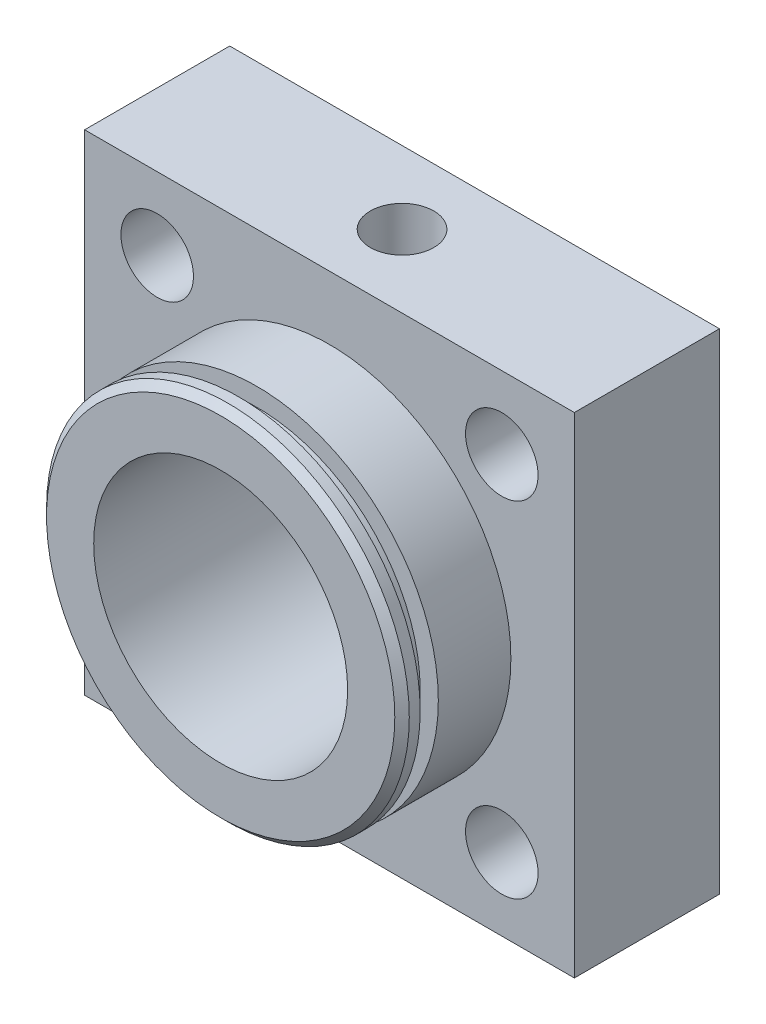
ISO-10303-21;
HEADER;
FILE_DESCRIPTION(('STEP AP214'),'2;1');
FILE_NAME('part.step','',(''),(''),'','','');
FILE_SCHEMA(('AUTOMOTIVE_DESIGN { 1 0 10303 214 1 1 1 1 }'));
ENDSEC;
DATA;
#1=APPLICATION_CONTEXT('core data for automotive mechanical design processes');
#2=APPLICATION_PROTOCOL_DEFINITION('international standard','automotive_design',2000,#1);
#3=PRODUCT_CONTEXT('',#1,'mechanical');
#4=PRODUCT('Part','Part','',(#3));
#5=PRODUCT_RELATED_PRODUCT_CATEGORY('part','',(#4));
#6=PRODUCT_DEFINITION_FORMATION('','',#4);
#7=PRODUCT_DEFINITION_CONTEXT('part definition',#1,'design');
#8=PRODUCT_DEFINITION('design','',#6,#7);
#9=PRODUCT_DEFINITION_SHAPE('','',#8);
#10=(LENGTH_UNIT() NAMED_UNIT(*) SI_UNIT(.MILLI.,.METRE.));
#11=(NAMED_UNIT(*) PLANE_ANGLE_UNIT() SI_UNIT($,.RADIAN.));
#12=(NAMED_UNIT(*) SI_UNIT($,.STERADIAN.) SOLID_ANGLE_UNIT());
#13=UNCERTAINTY_MEASURE_WITH_UNIT(LENGTH_MEASURE(1.E-05),#10,'distance_accuracy_value','');
#14=(GEOMETRIC_REPRESENTATION_CONTEXT(3) GLOBAL_UNCERTAINTY_ASSIGNED_CONTEXT((#13)) GLOBAL_UNIT_ASSIGNED_CONTEXT((#10,
#11,#12)) REPRESENTATION_CONTEXT('',''));
#15=CARTESIAN_POINT('',(0.,0.,0.));
#16=DIRECTION('',(0.,0.,1.));
#17=DIRECTION('',(1.,0.,0.));
#18=AXIS2_PLACEMENT_3D('',#15,#16,#17);
#19=CARTESIAN_POINT('',(-67.5,-67.5,40.));
#20=DIRECTION('',(1.,0.,0.));
#21=DIRECTION('',(0.,0.,-1.));
#22=AXIS2_PLACEMENT_3D('',#19,#20,#21);
#23=PLANE('',#22);
#24=DIRECTION('',(0.,-1.,0.));
#25=VECTOR('',#24,1.);
#26=CARTESIAN_POINT('',(-67.5,-67.5,0.));
#27=LINE('',#26,#25);
#28=CARTESIAN_POINT('',(-67.5,67.5,0.));
#29=VERTEX_POINT('',#28);
#30=CARTESIAN_POINT('',(-67.5,-67.5,0.));
#31=VERTEX_POINT('',#30);
#32=EDGE_CURVE('E123',#29,#31,#27,.T.);
#33=ORIENTED_EDGE('',*,*,#32,.T.);
#34=DIRECTION('',(0.,0.,-1.));
#35=VECTOR('',#34,1.);
#36=CARTESIAN_POINT('',(-67.5,-67.5,40.));
#37=LINE('',#36,#35);
#38=CARTESIAN_POINT('',(-67.5,-67.5,40.));
#39=VERTEX_POINT('',#38);
#40=EDGE_CURVE('E114',#39,#31,#37,.T.);
#41=ORIENTED_EDGE('',*,*,#40,.F.);
#42=DIRECTION('',(0.,-1.,0.));
#43=VECTOR('',#42,1.);
#44=CARTESIAN_POINT('',(-67.5,-67.5,40.));
#45=LINE('',#44,#43);
#46=CARTESIAN_POINT('',(-67.5,67.5,40.));
#47=VERTEX_POINT('',#46);
#48=EDGE_CURVE('E108',#47,#39,#45,.T.);
#49=ORIENTED_EDGE('',*,*,#48,.F.);
#50=DIRECTION('',(0.,0.,-1.));
#51=VECTOR('',#50,1.);
#52=CARTESIAN_POINT('',(-67.5,67.5,40.));
#53=LINE('',#52,#51);
#54=EDGE_CURVE('E119',#47,#29,#53,.T.);
#55=ORIENTED_EDGE('',*,*,#54,.T.);
#56=EDGE_LOOP('',(#33,#41,#49,#55));
#57=FACE_BOUND('',#56,.T.);
#58=ADVANCED_FACE('F47',(#57),#23,.F.);
#59=CARTESIAN_POINT('',(67.5,-67.5,40.));
#60=DIRECTION('',(0.,1.,0.));
#61=DIRECTION('',(-1.,0.,0.));
#62=AXIS2_PLACEMENT_3D('',#59,#60,#61);
#63=PLANE('',#62);
#64=CARTESIAN_POINT('',(0.,-67.5,20.));
#65=DIRECTION('',(0.,-1.,0.));
#66=DIRECTION('',(0.,0.,-1.));
#67=AXIS2_PLACEMENT_3D('',#64,#65,#66);
#68=CIRCLE('',#67,8.74999999999999);
#69=CARTESIAN_POINT('',(0.,-67.5,11.25));
#70=VERTEX_POINT('',#69);
#71=EDGE_CURVE('E307',#70,#70,#68,.T.);
#72=ORIENTED_EDGE('',*,*,#71,.F.);
#73=EDGE_LOOP('',(#72));
#74=FACE_BOUND('',#73,.T.);
#75=DIRECTION('',(1.,0.,0.));
#76=VECTOR('',#75,1.);
#77=CARTESIAN_POINT('',(67.5,-67.5,0.));
#78=LINE('',#77,#76);
#79=CARTESIAN_POINT('',(67.5,-67.5,0.));
#80=VERTEX_POINT('',#79);
#81=EDGE_CURVE('E113',#31,#80,#78,.T.);
#82=ORIENTED_EDGE('',*,*,#81,.T.);
#83=DIRECTION('',(0.,0.,-1.));
#84=VECTOR('',#83,1.);
#85=CARTESIAN_POINT('',(67.5,-67.5,40.));
#86=LINE('',#85,#84);
#87=CARTESIAN_POINT('',(67.5,-67.5,40.));
#88=VERTEX_POINT('',#87);
#89=EDGE_CURVE('E111',#88,#80,#86,.T.);
#90=ORIENTED_EDGE('',*,*,#89,.F.);
#91=DIRECTION('',(1.,0.,0.));
#92=VECTOR('',#91,1.);
#93=CARTESIAN_POINT('',(67.5,-67.5,40.));
#94=LINE('',#93,#92);
#95=EDGE_CURVE('E103',#39,#88,#94,.T.);
#96=ORIENTED_EDGE('',*,*,#95,.F.);
#97=ORIENTED_EDGE('',*,*,#40,.T.);
#98=EDGE_LOOP('',(#82,#90,#96,#97));
#99=FACE_BOUND('',#98,.T.);
#100=ADVANCED_FACE('F112',(#74,#99),#63,.F.);
#101=CARTESIAN_POINT('',(67.5,-67.5,40.));
#102=DIRECTION('',(-1.,0.,0.));
#103=DIRECTION('',(0.,0.,1.));
#104=AXIS2_PLACEMENT_3D('',#101,#102,#103);
#105=PLANE('',#104);
#106=DIRECTION('',(0.,1.,0.));
#107=VECTOR('',#106,1.);
#108=CARTESIAN_POINT('',(67.5,-67.5,0.));
#109=LINE('',#108,#107);
#110=CARTESIAN_POINT('',(67.5,67.5,0.));
#111=VERTEX_POINT('',#110);
#112=EDGE_CURVE('E89',#80,#111,#109,.T.);
#113=ORIENTED_EDGE('',*,*,#112,.T.);
#114=DIRECTION('',(0.,0.,-1.));
#115=VECTOR('',#114,1.);
#116=CARTESIAN_POINT('',(67.5,67.5,40.));
#117=LINE('',#116,#115);
#118=CARTESIAN_POINT('',(67.5,67.5,40.));
#119=VERTEX_POINT('',#118);
#120=EDGE_CURVE('E115',#119,#111,#117,.T.);
#121=ORIENTED_EDGE('',*,*,#120,.F.);
#122=DIRECTION('',(0.,1.,0.));
#123=VECTOR('',#122,1.);
#124=CARTESIAN_POINT('',(67.5,-67.5,40.));
#125=LINE('',#124,#123);
#126=EDGE_CURVE('E106',#88,#119,#125,.T.);
#127=ORIENTED_EDGE('',*,*,#126,.F.);
#128=ORIENTED_EDGE('',*,*,#89,.T.);
#129=EDGE_LOOP('',(#113,#121,#127,#128));
#130=FACE_BOUND('',#129,.T.);
#131=ADVANCED_FACE('F117',(#130),#105,.F.);
#132=CARTESIAN_POINT('',(67.5,67.5,40.));
#133=DIRECTION('',(0.,-1.,0.));
#134=DIRECTION('',(1.,0.,0.));
#135=AXIS2_PLACEMENT_3D('',#132,#133,#134);
#136=PLANE('',#135);
#137=CARTESIAN_POINT('',(0.,67.5,20.));
#138=DIRECTION('',(0.,-1.,0.));
#139=DIRECTION('',(0.,0.,-1.));
#140=AXIS2_PLACEMENT_3D('',#137,#138,#139);
#141=CIRCLE('',#140,8.74999999999998);
#142=CARTESIAN_POINT('',(0.,67.5,11.25));
#143=VERTEX_POINT('',#142);
#144=EDGE_CURVE('E141',#143,#143,#141,.T.);
#145=ORIENTED_EDGE('',*,*,#144,.T.);
#146=EDGE_LOOP('',(#145));
#147=FACE_BOUND('',#146,.T.);
#148=DIRECTION('',(-1.,0.,0.));
#149=VECTOR('',#148,1.);
#150=CARTESIAN_POINT('',(67.5,67.5,0.));
#151=LINE('',#150,#149);
#152=EDGE_CURVE('E95',#111,#29,#151,.T.);
#153=ORIENTED_EDGE('',*,*,#152,.T.);
#154=ORIENTED_EDGE('',*,*,#54,.F.);
#155=DIRECTION('',(-1.,0.,0.));
#156=VECTOR('',#155,1.);
#157=CARTESIAN_POINT('',(67.5,67.5,40.));
#158=LINE('',#157,#156);
#159=EDGE_CURVE('E72',#119,#47,#158,.T.);
#160=ORIENTED_EDGE('',*,*,#159,.F.);
#161=ORIENTED_EDGE('',*,*,#120,.T.);
#162=EDGE_LOOP('',(#153,#154,#160,#161));
#163=FACE_BOUND('',#162,.T.);
#164=ADVANCED_FACE('F174',(#147,#163),#136,.F.);
#165=CARTESIAN_POINT('',(0.,0.,40.));
#166=DIRECTION('',(0.,0.,1.));
#167=DIRECTION('',(1.,0.,0.));
#168=AXIS2_PLACEMENT_3D('',#165,#166,#167);
#169=PLANE('',#168);
#170=CARTESIAN_POINT('',(0.,0.,40.));
#171=DIRECTION('',(0.,0.,1.));
#172=DIRECTION('',(1.,0.,0.));
#173=AXIS2_PLACEMENT_3D('',#170,#171,#172);
#174=CIRCLE('',#173,50.);
#175=CARTESIAN_POINT('',(50.,0.,40.));
#176=VERTEX_POINT('',#175);
#177=EDGE_CURVE('E133',#176,#176,#174,.T.);
#178=ORIENTED_EDGE('',*,*,#177,.F.);
#179=EDGE_LOOP('',(#178));
#180=FACE_BOUND('',#179,.T.);
#181=CARTESIAN_POINT('',(-47.5,-47.5,40.));
#182=DIRECTION('',(0.,0.,1.));
#183=DIRECTION('',(-1.,0.,0.));
#184=AXIS2_PLACEMENT_3D('',#181,#182,#183);
#185=CIRCLE('',#184,9.99999999999999);
#186=CARTESIAN_POINT('',(-57.5,-47.5,40.));
#187=VERTEX_POINT('',#186);
#188=EDGE_CURVE('E269',#187,#187,#185,.T.);
#189=ORIENTED_EDGE('',*,*,#188,.F.);
#190=EDGE_LOOP('',(#189));
#191=FACE_BOUND('',#190,.T.);
#192=CARTESIAN_POINT('',(47.4999999999999,-47.5,40.));
#193=DIRECTION('',(0.,0.,1.));
#194=DIRECTION('',(1.,0.,0.));
#195=AXIS2_PLACEMENT_3D('',#192,#193,#194);
#196=CIRCLE('',#195,10.);
#197=CARTESIAN_POINT('',(57.4999999999999,-47.5,40.));
#198=VERTEX_POINT('',#197);
#199=EDGE_CURVE('E263',#198,#198,#196,.T.);
#200=ORIENTED_EDGE('',*,*,#199,.F.);
#201=EDGE_LOOP('',(#200));
#202=FACE_BOUND('',#201,.T.);
#203=CARTESIAN_POINT('',(47.5,47.5,40.));
#204=DIRECTION('',(0.,0.,1.));
#205=DIRECTION('',(-1.,0.,0.));
#206=AXIS2_PLACEMENT_3D('',#203,#204,#205);
#207=CIRCLE('',#206,10.);
#208=CARTESIAN_POINT('',(37.5,47.5,40.));
#209=VERTEX_POINT('',#208);
#210=EDGE_CURVE('E256',#209,#209,#207,.T.);
#211=ORIENTED_EDGE('',*,*,#210,.F.);
#212=EDGE_LOOP('',(#211));
#213=FACE_BOUND('',#212,.T.);
#214=CARTESIAN_POINT('',(-47.5,47.5,40.));
#215=DIRECTION('',(0.,0.,1.));
#216=DIRECTION('',(1.,0.,0.));
#217=AXIS2_PLACEMENT_3D('',#214,#215,#216);
#218=CIRCLE('',#217,10.);
#219=CARTESIAN_POINT('',(-37.5,47.5,40.));
#220=VERTEX_POINT('',#219);
#221=EDGE_CURVE('E259',#220,#220,#218,.T.);
#222=ORIENTED_EDGE('',*,*,#221,.F.);
#223=EDGE_LOOP('',(#222));
#224=FACE_BOUND('',#223,.T.);
#225=ORIENTED_EDGE('',*,*,#48,.T.);
#226=ORIENTED_EDGE('',*,*,#95,.T.);
#227=ORIENTED_EDGE('',*,*,#126,.T.);
#228=ORIENTED_EDGE('',*,*,#159,.T.);
#229=EDGE_LOOP('',(#225,#226,#227,#228));
#230=FACE_BOUND('',#229,.T.);
#231=ADVANCED_FACE('F104',(#180,#191,#202,#213,#224,#230),#169,.T.);
#232=CARTESIAN_POINT('',(0.,0.,0.));
#233=DIRECTION('',(0.,0.,1.));
#234=DIRECTION('',(1.,0.,0.));
#235=AXIS2_PLACEMENT_3D('',#232,#233,#234);
#236=PLANE('',#235);
#237=CARTESIAN_POINT('',(-47.5,-47.5,0.));
#238=DIRECTION('',(0.,0.,1.));
#239=DIRECTION('',(-1.,0.,0.));
#240=AXIS2_PLACEMENT_3D('',#237,#238,#239);
#241=CIRCLE('',#240,9.99999999999999);
#242=CARTESIAN_POINT('',(-57.5,-47.5,0.));
#243=VERTEX_POINT('',#242);
#244=EDGE_CURVE('E253',#243,#243,#241,.T.);
#245=ORIENTED_EDGE('',*,*,#244,.T.);
#246=EDGE_LOOP('',(#245));
#247=FACE_BOUND('',#246,.T.);
#248=CARTESIAN_POINT('',(47.4999999999999,-47.5,0.));
#249=DIRECTION('',(0.,0.,1.));
#250=DIRECTION('',(1.,0.,0.));
#251=AXIS2_PLACEMENT_3D('',#248,#249,#250);
#252=CIRCLE('',#251,10.);
#253=CARTESIAN_POINT('',(57.4999999999999,-47.5,0.));
#254=VERTEX_POINT('',#253);
#255=EDGE_CURVE('E266',#254,#254,#252,.T.);
#256=ORIENTED_EDGE('',*,*,#255,.T.);
#257=EDGE_LOOP('',(#256));
#258=FACE_BOUND('',#257,.T.);
#259=CARTESIAN_POINT('',(47.5,47.5,0.));
#260=DIRECTION('',(0.,0.,1.));
#261=DIRECTION('',(-1.,0.,0.));
#262=AXIS2_PLACEMENT_3D('',#259,#260,#261);
#263=CIRCLE('',#262,10.);
#264=CARTESIAN_POINT('',(37.5,47.5,0.));
#265=VERTEX_POINT('',#264);
#266=EDGE_CURVE('E260',#265,#265,#263,.T.);
#267=ORIENTED_EDGE('',*,*,#266,.T.);
#268=EDGE_LOOP('',(#267));
#269=FACE_BOUND('',#268,.T.);
#270=CARTESIAN_POINT('',(-47.5,47.5,0.));
#271=DIRECTION('',(0.,0.,1.));
#272=DIRECTION('',(1.,0.,0.));
#273=AXIS2_PLACEMENT_3D('',#270,#271,#272);
#274=CIRCLE('',#273,10.);
#275=CARTESIAN_POINT('',(-37.5,47.5,0.));
#276=VERTEX_POINT('',#275);
#277=EDGE_CURVE('E126',#276,#276,#274,.T.);
#278=ORIENTED_EDGE('',*,*,#277,.T.);
#279=EDGE_LOOP('',(#278));
#280=FACE_BOUND('',#279,.T.);
#281=ORIENTED_EDGE('',*,*,#32,.F.);
#282=ORIENTED_EDGE('',*,*,#152,.F.);
#283=ORIENTED_EDGE('',*,*,#112,.F.);
#284=ORIENTED_EDGE('',*,*,#81,.F.);
#285=EDGE_LOOP('',(#281,#282,#283,#284));
#286=FACE_BOUND('',#285,.T.);
#287=ADVANCED_FACE('F178',(#247,#258,#269,#280,#286),#236,.F.);
#288=CARTESIAN_POINT('',(-47.5,47.5,0.));
#289=DIRECTION('',(0.,0.,1.));
#290=DIRECTION('',(1.,0.,0.));
#291=AXIS2_PLACEMENT_3D('',#288,#289,#290);
#292=CYLINDRICAL_SURFACE('',#291,10.);
#293=ORIENTED_EDGE('',*,*,#277,.F.);
#294=EDGE_LOOP('',(#293));
#295=FACE_BOUND('',#294,.T.);
#296=ORIENTED_EDGE('',*,*,#221,.T.);
#297=EDGE_LOOP('',(#296));
#298=FACE_BOUND('',#297,.T.);
#299=ADVANCED_FACE('F181',(#295,#298),#292,.F.);
#300=CARTESIAN_POINT('',(47.5,47.5,0.));
#301=DIRECTION('',(0.,0.,1.));
#302=DIRECTION('',(1.,0.,0.));
#303=AXIS2_PLACEMENT_3D('',#300,#301,#302);
#304=CYLINDRICAL_SURFACE('',#303,10.);
#305=ORIENTED_EDGE('',*,*,#266,.F.);
#306=EDGE_LOOP('',(#305));
#307=FACE_BOUND('',#306,.T.);
#308=ORIENTED_EDGE('',*,*,#210,.T.);
#309=EDGE_LOOP('',(#308));
#310=FACE_BOUND('',#309,.T.);
#311=ADVANCED_FACE('F188',(#307,#310),#304,.F.);
#312=CARTESIAN_POINT('',(47.4999999999999,-47.5,0.));
#313=DIRECTION('',(0.,0.,1.));
#314=DIRECTION('',(1.,0.,0.));
#315=AXIS2_PLACEMENT_3D('',#312,#313,#314);
#316=CYLINDRICAL_SURFACE('',#315,10.);
#317=ORIENTED_EDGE('',*,*,#255,.F.);
#318=EDGE_LOOP('',(#317));
#319=FACE_BOUND('',#318,.T.);
#320=ORIENTED_EDGE('',*,*,#199,.T.);
#321=EDGE_LOOP('',(#320));
#322=FACE_BOUND('',#321,.T.);
#323=ADVANCED_FACE('F194',(#319,#322),#316,.F.);
#324=CARTESIAN_POINT('',(-47.5,-47.5,0.));
#325=DIRECTION('',(0.,0.,1.));
#326=DIRECTION('',(1.,0.,0.));
#327=AXIS2_PLACEMENT_3D('',#324,#325,#326);
#328=CYLINDRICAL_SURFACE('',#327,9.99999999999999);
#329=ORIENTED_EDGE('',*,*,#244,.F.);
#330=EDGE_LOOP('',(#329));
#331=FACE_BOUND('',#330,.T.);
#332=ORIENTED_EDGE('',*,*,#188,.T.);
#333=EDGE_LOOP('',(#332));
#334=FACE_BOUND('',#333,.T.);
#335=ADVANCED_FACE('F190',(#331,#334),#328,.F.);
#336=CARTESIAN_POINT('',(0.,0.,60.));
#337=DIRECTION('',(0.,0.,-1.));
#338=DIRECTION('',(-1.,0.,0.));
#339=AXIS2_PLACEMENT_3D('',#336,#337,#338);
#340=CYLINDRICAL_SURFACE('',#339,50.);
#341=CARTESIAN_POINT('',(0.,0.,60.));
#342=DIRECTION('',(0.,0.,1.));
#343=DIRECTION('',(1.,0.,0.));
#344=AXIS2_PLACEMENT_3D('',#341,#342,#343);
#345=CIRCLE('',#344,50.);
#346=CARTESIAN_POINT('',(50.,0.,60.));
#347=VERTEX_POINT('',#346);
#348=EDGE_CURVE('E244',#347,#347,#345,.T.);
#349=ORIENTED_EDGE('',*,*,#348,.F.);
#350=EDGE_LOOP('',(#349));
#351=FACE_BOUND('',#350,.T.);
#352=ORIENTED_EDGE('',*,*,#177,.T.);
#353=EDGE_LOOP('',(#352));
#354=FACE_BOUND('',#353,.T.);
#355=ADVANCED_FACE('F193',(#351,#354),#340,.T.);
#356=CARTESIAN_POINT('',(0.,0.,60.));
#357=DIRECTION('',(0.,0.,1.));
#358=DIRECTION('',(1.,0.,0.));
#359=AXIS2_PLACEMENT_3D('',#356,#357,#358);
#360=PLANE('',#359);
#361=CARTESIAN_POINT('',(0.,0.,60.));
#362=DIRECTION('',(0.,0.,1.));
#363=DIRECTION('',(1.,0.,0.));
#364=AXIS2_PLACEMENT_3D('',#361,#362,#363);
#365=CIRCLE('',#364,45.);
#366=CARTESIAN_POINT('',(45.,0.,60.));
#367=VERTEX_POINT('',#366);
#368=EDGE_CURVE('E135',#367,#367,#365,.T.);
#369=ORIENTED_EDGE('',*,*,#368,.F.);
#370=EDGE_LOOP('',(#369));
#371=FACE_BOUND('',#370,.T.);
#372=ORIENTED_EDGE('',*,*,#348,.T.);
#373=EDGE_LOOP('',(#372));
#374=FACE_BOUND('',#373,.T.);
#375=ADVANCED_FACE('F204',(#371,#374),#360,.T.);
#376=CARTESIAN_POINT('',(0.,0.,65.));
#377=DIRECTION('',(0.,0.,-1.));
#378=DIRECTION('',(-1.,0.,0.));
#379=AXIS2_PLACEMENT_3D('',#376,#377,#378);
#380=CYLINDRICAL_SURFACE('',#379,45.);
#381=CARTESIAN_POINT('',(0.,0.,65.));
#382=DIRECTION('',(0.,0.,1.));
#383=DIRECTION('',(1.,0.,0.));
#384=AXIS2_PLACEMENT_3D('',#381,#382,#383);
#385=CIRCLE('',#384,45.);
#386=CARTESIAN_POINT('',(45.,0.,65.));
#387=VERTEX_POINT('',#386);
#388=EDGE_CURVE('E240',#387,#387,#385,.T.);
#389=ORIENTED_EDGE('',*,*,#388,.F.);
#390=EDGE_LOOP('',(#389));
#391=FACE_BOUND('',#390,.T.);
#392=ORIENTED_EDGE('',*,*,#368,.T.);
#393=EDGE_LOOP('',(#392));
#394=FACE_BOUND('',#393,.T.);
#395=ADVANCED_FACE('F208',(#391,#394),#380,.T.);
#396=CARTESIAN_POINT('',(0.,0.,70.));
#397=DIRECTION('',(0.,0.,-1.));
#398=DIRECTION('',(-1.,0.,0.));
#399=AXIS2_PLACEMENT_3D('',#396,#397,#398);
#400=CYLINDRICAL_SURFACE('',#399,50.);
#401=CARTESIAN_POINT('',(0.,0.,67.9999999999999));
#402=DIRECTION('',(0.,0.,1.));
#403=DIRECTION('',(1.,0.,0.));
#404=AXIS2_PLACEMENT_3D('',#401,#402,#403);
#405=CIRCLE('',#404,50.);
#406=CARTESIAN_POINT('',(50.,0.,67.9999999999999));
#407=VERTEX_POINT('',#406);
#408=EDGE_CURVE('E11',#407,#407,#405,.F.);
#409=ORIENTED_EDGE('',*,*,#408,.T.);
#410=EDGE_LOOP('',(#409));
#411=FACE_BOUND('',#410,.T.);
#412=CARTESIAN_POINT('',(0.,0.,65.));
#413=DIRECTION('',(0.,0.,1.));
#414=DIRECTION('',(1.,0.,0.));
#415=AXIS2_PLACEMENT_3D('',#412,#413,#414);
#416=CIRCLE('',#415,50.);
#417=CARTESIAN_POINT('',(50.,0.,65.));
#418=VERTEX_POINT('',#417);
#419=EDGE_CURVE('E238',#418,#418,#416,.T.);
#420=ORIENTED_EDGE('',*,*,#419,.T.);
#421=EDGE_LOOP('',(#420));
#422=FACE_BOUND('',#421,.T.);
#423=ADVANCED_FACE('F212',(#411,#422),#400,.T.);
#424=CARTESIAN_POINT('',(0.,0.,70.));
#425=DIRECTION('',(0.,0.,1.));
#426=DIRECTION('',(1.,0.,0.));
#427=AXIS2_PLACEMENT_3D('',#424,#425,#426);
#428=PLANE('',#427);
#429=CARTESIAN_POINT('',(0.,0.,70.));
#430=DIRECTION('',(0.,0.,1.));
#431=DIRECTION('',(1.,0.,0.));
#432=AXIS2_PLACEMENT_3D('',#429,#430,#431);
#433=CIRCLE('',#432,35.);
#434=CARTESIAN_POINT('',(35.,0.,70.));
#435=VERTEX_POINT('',#434);
#436=EDGE_CURVE('E228',#435,#435,#433,.T.);
#437=ORIENTED_EDGE('',*,*,#436,.F.);
#438=EDGE_LOOP('',(#437));
#439=FACE_BOUND('',#438,.T.);
#440=CARTESIAN_POINT('',(0.,0.,70.));
#441=DIRECTION('',(0.,0.,1.));
#442=DIRECTION('',(1.,0.,0.));
#443=AXIS2_PLACEMENT_3D('',#440,#441,#442);
#444=CIRCLE('',#443,48.);
#445=CARTESIAN_POINT('',(48.,0.,70.));
#446=VERTEX_POINT('',#445);
#447=EDGE_CURVE('E63',#446,#446,#444,.T.);
#448=ORIENTED_EDGE('',*,*,#447,.T.);
#449=EDGE_LOOP('',(#448));
#450=FACE_BOUND('',#449,.T.);
#451=ADVANCED_FACE('F216',(#439,#450),#428,.T.);
#452=CARTESIAN_POINT('',(0.,0.,65.));
#453=DIRECTION('',(0.,0.,1.));
#454=DIRECTION('',(1.,0.,0.));
#455=AXIS2_PLACEMENT_3D('',#452,#453,#454);
#456=PLANE('',#455);
#457=ORIENTED_EDGE('',*,*,#388,.T.);
#458=EDGE_LOOP('',(#457));
#459=FACE_BOUND('',#458,.T.);
#460=ORIENTED_EDGE('',*,*,#419,.F.);
#461=EDGE_LOOP('',(#460));
#462=FACE_BOUND('',#461,.T.);
#463=ADVANCED_FACE('F218',(#459,#462),#456,.F.);
#464=CARTESIAN_POINT('',(0.,0.,70.));
#465=DIRECTION('',(0.,0.,-1.));
#466=DIRECTION('',(-1.,0.,0.));
#467=AXIS2_PLACEMENT_3D('',#464,#465,#466);
#468=CONICAL_SURFACE('',#467,48.,0.785398163397445);
#469=ORIENTED_EDGE('',*,*,#408,.F.);
#470=EDGE_LOOP('',(#469));
#471=FACE_BOUND('',#470,.T.);
#472=ORIENTED_EDGE('',*,*,#447,.F.);
#473=EDGE_LOOP('',(#472));
#474=FACE_BOUND('',#473,.T.);
#475=ADVANCED_FACE('F50',(#471,#474),#468,.T.);
#476=CARTESIAN_POINT('',(0.,0.,5.));
#477=DIRECTION('',(0.,0.,1.));
#478=DIRECTION('',(1.,0.,0.));
#479=AXIS2_PLACEMENT_3D('',#476,#477,#478);
#480=CYLINDRICAL_SURFACE('',#479,35.);
#481=CARTESIAN_POINT('',(0.,35.,11.25));
#482=CARTESIAN_POINT('',(-0.241799523299091,35.0000043695715,11.2499927827405));
#483=CARTESIAN_POINT('',(-0.483520068047024,34.9974905491828,11.2600244008793));
#484=CARTESIAN_POINT('',(-0.965268414696347,34.9875150728127,11.3000497987794));
#485=CARTESIAN_POINT('',(-1.20529602030684,34.9800528523102,11.330045856116));
#486=CARTESIAN_POINT('',(-1.68191721445111,34.9603789436895,11.4097687521843));
#487=CARTESIAN_POINT('',(-1.91850971450473,34.9481657828035,11.4595017093523));
#488=CARTESIAN_POINT('',(-2.3866061796372,34.9193229164648,11.5783057100194));
#489=CARTESIAN_POINT('',(-2.61810823392174,34.9026915822078,11.6473838858388));
#490=CARTESIAN_POINT('',(-3.0739603197344,34.8654985597494,11.8041915451215));
#491=CARTESIAN_POINT('',(-3.29832118373702,34.8449431914352,11.8918910629756));
#492=CARTESIAN_POINT('',(-3.73885381453022,34.8004311564411,12.0853698437051));
#493=CARTESIAN_POINT('',(-3.95502247859617,34.7764732170586,12.1911558747179));
#494=CARTESIAN_POINT('',(-4.37758228105958,34.7258123419916,12.4199618420133));
#495=CARTESIAN_POINT('',(-4.58397735704459,34.6991105257452,12.5429747574995));
#496=CARTESIAN_POINT('',(-4.98585839902349,34.6436486032233,12.8054641101226));
#497=CARTESIAN_POINT('',(-5.18133932040703,34.6148875589461,12.9449480690322));
#498=CARTESIAN_POINT('',(-5.56356700376522,34.5555324255632,13.2421229250962));
#499=CARTESIAN_POINT('',(-5.75008538597825,34.5249142736792,13.4001028259829));
#500=CARTESIAN_POINT('',(-6.10913672588681,34.4631923165244,13.730986928345));
#501=CARTESIAN_POINT('',(-6.28167567208607,34.4320887260886,13.9038846730749));
#502=CARTESIAN_POINT('',(-6.61181639747486,34.3702212811019,14.2636235239612));
#503=CARTESIAN_POINT('',(-6.76941037131434,34.3394576114117,14.4504718260552));
#504=CARTESIAN_POINT('',(-7.06844737761761,34.2791527863576,14.8367464190324));
#505=CARTESIAN_POINT('',(-7.20989643016502,34.2496111779512,15.0361679782833));
#506=CARTESIAN_POINT('',(-7.47776612625394,34.1921346589743,15.4494963906511));
#507=CARTESIAN_POINT('',(-7.60392393043699,34.1642312194141,15.6635780964474));
#508=CARTESIAN_POINT('',(-7.83766283188959,34.1113676301319,16.1018971284711));
#509=CARTESIAN_POINT('',(-7.94525106980855,34.0864063502223,16.326130508966));
#510=CARTESIAN_POINT('',(-8.14107411847624,34.0401680678269,16.7832859209123));
#511=CARTESIAN_POINT('',(-8.22930748528217,34.0188913402468,17.0162085991008));
#512=CARTESIAN_POINT('',(-8.38568051248059,33.9806834660429,17.4890508397448));
#513=CARTESIAN_POINT('',(-8.45382065418537,33.9637522153291,17.72897023445));
#514=CARTESIAN_POINT('',(-8.56826273941721,33.9350598380527,18.2091703602281));
#515=CARTESIAN_POINT('',(-8.61497474459365,33.9232019513377,18.4493476080716));
#516=CARTESIAN_POINT('',(-8.68813785695589,33.9045379070742,18.932963659827));
#517=CARTESIAN_POINT('',(-8.71458920976721,33.8977316882829,19.1764024241621));
#518=CARTESIAN_POINT('',(-8.74699568171501,33.8893839980862,19.6646959067607));
#519=CARTESIAN_POINT('',(-8.7529537109232,33.887841779188,19.9095504190398));
#520=CARTESIAN_POINT('',(-8.74432825221232,33.8900685154391,20.3988712121535));
#521=CARTESIAN_POINT('',(-8.72974504991735,33.8938373967381,20.643337498339));
#522=CARTESIAN_POINT('',(-8.68077538249157,33.9064117105816,21.1240939355488));
#523=CARTESIAN_POINT('',(-8.64688206589014,33.9150916851047,21.3604378061277));
#524=CARTESIAN_POINT('',(-8.55993865039065,33.9371398245965,21.8294400669052));
#525=CARTESIAN_POINT('',(-8.50688165033293,33.9505096784183,22.0620970978647));
#526=CARTESIAN_POINT('',(-8.38205168790234,33.9815441010646,22.5219983088027));
#527=CARTESIAN_POINT('',(-8.31028163662384,33.9992080018571,22.7492433247053));
#528=CARTESIAN_POINT('',(-8.14857675360341,34.0383256138059,23.1968461878021));
#529=CARTESIAN_POINT('',(-8.05864109786731,34.0597794968708,23.4172037220555));
#530=CARTESIAN_POINT('',(-7.86028234631322,34.1061054991642,23.8517633359928));
#531=CARTESIAN_POINT('',(-7.75168255190294,34.1310098018236,24.0658813071379));
#532=CARTESIAN_POINT('',(-7.51741613256294,34.1833710075284,24.4842429822625));
#533=CARTESIAN_POINT('',(-7.39174905870467,34.2108279777118,24.688486426316));
#534=CARTESIAN_POINT('',(-7.12419692769022,34.2675431492183,25.0858325843066));
#535=CARTESIAN_POINT('',(-6.98230968739967,34.2968015927634,25.278933793292));
#536=CARTESIAN_POINT('',(-6.68326713116924,34.3563265968551,25.6527637059941));
#537=CARTESIAN_POINT('',(-6.52611151483398,34.3865931772283,25.8334921661656));
#538=CARTESIAN_POINT('',(-6.1928427657729,34.4481961684433,26.1864183382612));
#539=CARTESIAN_POINT('',(-6.0163164559308,34.4795384500757,26.3582251134267));
#540=CARTESIAN_POINT('',(-5.64934842718306,34.5415616776077,26.6864007085305));
#541=CARTESIAN_POINT('',(-5.45890676688688,34.572242626292,26.8427695934844));
#542=CARTESIAN_POINT('',(-5.06534815423349,34.6320929199522,27.1390063436303));
#543=CARTESIAN_POINT('',(-4.86223035738417,34.6612621639799,27.2788731076427));
#544=CARTESIAN_POINT('',(-4.44468838286475,34.7172738797167,27.5410885509639));
#545=CARTESIAN_POINT('',(-4.23026462914772,34.7441164385726,27.6634378865065));
#546=CARTESIAN_POINT('',(-3.79074451033565,34.7948180728427,27.890128045316));
#547=CARTESIAN_POINT('',(-3.56561173142843,34.8186657906871,27.9944008521543));
#548=CARTESIAN_POINT('',(-3.10707469593024,34.8625745531645,28.1835241029548));
#549=CARTESIAN_POINT('',(-2.87367374263857,34.8826370902314,28.2683822046311));
#550=CARTESIAN_POINT('',(-2.40018489282947,34.9184117209907,28.4180318827279));
#551=CARTESIAN_POINT('',(-2.16009669807542,34.9341236203111,28.4828225626176));
#552=CARTESIAN_POINT('',(-1.67502340418714,34.96073923671,28.5917741764395));
#553=CARTESIAN_POINT('',(-1.43003842593633,34.971643072329,28.6359356189768));
#554=CARTESIAN_POINT('',(-0.94334164825739,34.9881104053636,28.7023776627804));
#555=CARTESIAN_POINT('',(-0.701706644020073,34.9938034876629,28.7251895464599));
#556=CARTESIAN_POINT('',(-0.217312358656552,35.0001634242995,28.7506624806319));
#557=CARTESIAN_POINT('',(0.0254469032188993,35.0008303643839,28.7533238748955));
#558=CARTESIAN_POINT('',(0.51028754600816,34.9971195241709,28.7384738771979));
#559=CARTESIAN_POINT('',(0.752368981458318,34.9927421621424,28.720964157807));
#560=CARTESIAN_POINT('',(1.23410313242198,34.9790659361253,28.6659254013057));
#561=CARTESIAN_POINT('',(1.47375585742777,34.9697670913791,28.6283964424687));
#562=CARTESIAN_POINT('',(1.94532440898076,34.9466823513444,28.5343511030556));
#563=CARTESIAN_POINT('',(2.17730238816364,34.9329660403135,28.4781287638607));
#564=CARTESIAN_POINT('',(2.63571350382193,34.9013727768726,28.3469976258953));
#565=CARTESIAN_POINT('',(2.86214460470993,34.8834943215936,28.2720820766687));
#566=CARTESIAN_POINT('',(3.30782932633503,34.8440570603617,28.1041635764653));
#567=CARTESIAN_POINT('',(3.52708385989012,34.8224987246534,28.0111629363347));
#568=CARTESIAN_POINT('',(3.95702806331242,34.7762661259076,27.8077519670753));
#569=CARTESIAN_POINT('',(4.16771733143583,34.7515917169368,27.6973408225093));
#570=CARTESIAN_POINT('',(4.58283276985595,34.6993109881678,27.4577867126412));
#571=CARTESIAN_POINT('',(4.78708190998904,34.6716604788256,27.3283466050096));
#572=CARTESIAN_POINT('',(5.18400810648092,34.6145384635652,27.0531471937465));
#573=CARTESIAN_POINT('',(5.37668478897487,34.5850668988775,26.9073873633183));
#574=CARTESIAN_POINT('',(5.74926397310817,34.5250862204719,26.6005089993607));
#575=CARTESIAN_POINT('',(5.92916468000145,34.4945769618674,26.4393883153839));
#576=CARTESIAN_POINT('',(6.27502133453905,34.4333407763495,26.1028540567975));
#577=CARTESIAN_POINT('',(6.44097710879124,34.4026138467347,25.9274403045205));
#578=CARTESIAN_POINT('',(6.76177551246698,34.3410210534494,25.5589585347706));
#579=CARTESIAN_POINT('',(6.91624448825218,34.3101703553513,25.3655624504475));
#580=CARTESIAN_POINT('',(7.20834844804723,34.2499920889207,24.9662270549499));
#581=CARTESIAN_POINT('',(7.34598350357079,34.2206645141179,24.7602877970666));
#582=CARTESIAN_POINT('',(7.60343046336959,34.1643851838145,24.3372405510884));
#583=CARTESIAN_POINT('',(7.72324229172896,34.1374334384336,24.1201325154267));
#584=CARTESIAN_POINT('',(7.94413160786342,34.0867074143669,23.6762381203699));
#585=CARTESIAN_POINT('',(8.04520997194652,34.0629329870681,23.4494522142939));
#586=CARTESIAN_POINT('',(8.22730651900035,34.019408389123,22.98911976521));
#587=CARTESIAN_POINT('',(8.30843756639257,33.9996356943008,22.7556200210376));
#588=CARTESIAN_POINT('',(8.4506988953312,33.964555944106,22.2823701603687));
#589=CARTESIAN_POINT('',(8.51183675802621,33.9492471963033,22.0426224503368));
#590=CARTESIAN_POINT('',(8.61362779462078,33.9235637360288,21.5585528933568));
#591=CARTESIAN_POINT('',(8.65428085473065,33.9131890509649,21.3142310210078));
#592=CARTESIAN_POINT('',(8.71473904507718,33.8977034938462,20.8228575874181));
#593=CARTESIAN_POINT('',(8.73454467689365,33.8925924951495,20.5758060919953));
#594=CARTESIAN_POINT('',(8.75286313708363,33.8878661068046,20.08798487179));
#595=CARTESIAN_POINT('',(8.75197192932361,33.8880969000187,19.8472388150264));
#596=CARTESIAN_POINT('',(8.73036501136017,33.8936697862549,19.366698151602));
#597=CARTESIAN_POINT('',(8.70964945897608,33.8990118385867,19.126903537382));
#598=CARTESIAN_POINT('',(8.6485721735212,33.9146456483631,18.6500036267133));
#599=CARTESIAN_POINT('',(8.60821108341681,33.924937243817,18.4128982425102));
#600=CARTESIAN_POINT('',(8.50818106883449,33.9501621645281,17.9430491110037));
#601=CARTESIAN_POINT('',(8.44851204756691,33.9650955130541,17.7103053855713));
#602=CARTESIAN_POINT('',(8.31077651422011,33.9990586211512,17.2522102166318));
#603=CARTESIAN_POINT('',(8.2328255898824,34.0180625812892,17.0268220694459));
#604=CARTESIAN_POINT('',(8.05890117165103,34.0596844373231,16.5833704894051));
#605=CARTESIAN_POINT('',(7.96292157734662,34.0823035561028,16.3653095654129));
#606=CARTESIAN_POINT('',(7.7536693156567,34.1305161402331,15.938017731216));
#607=CARTESIAN_POINT('',(7.64039802758809,34.1561093683073,15.7287861184161));
#608=CARTESIAN_POINT('',(7.39734356875771,34.209571551935,15.3204414187231));
#609=CARTESIAN_POINT('',(7.26755960497191,34.2374406167629,15.1213288184403));
#610=CARTESIAN_POINT('',(6.98875632579051,34.2954527203306,14.7294104040221));
#611=CARTESIAN_POINT('',(6.83932358891428,34.3256361112221,14.5369045517282));
#612=CARTESIAN_POINT('',(6.52499681599357,34.3867713572701,14.165089424418));
#613=CARTESIAN_POINT('',(6.36010255768644,34.4177232234689,13.9857803391742));
#614=CARTESIAN_POINT('',(6.01589396633648,34.479553283205,13.6414790573763));
#615=CARTESIAN_POINT('',(5.83657615340854,34.5104314571016,13.4764903358937));
#616=CARTESIAN_POINT('',(5.46472074024133,34.5712642989083,13.1619720085236));
#617=CARTESIAN_POINT('',(5.27218341824645,34.6012189862367,13.0124420774252));
#618=CARTESIAN_POINT('',(4.87147782235829,34.6599256024024,12.7272579095282));
#619=CARTESIAN_POINT('',(4.66308747718853,34.6886453540504,12.5919088113217));
#620=CARTESIAN_POINT('',(4.2353743584563,34.7434608862658,12.3393361981768));
#621=CARTESIAN_POINT('',(4.01605563124779,34.7695576273911,12.2221060394849));
#622=CARTESIAN_POINT('',(3.56801218673186,34.8183861246489,12.0066569968068));
#623=CARTESIAN_POINT('',(3.33929158110853,34.8411193321506,11.9084299073116));
#624=CARTESIAN_POINT('',(2.87406877701833,34.8825793149896,11.7317365652019));
#625=CARTESIAN_POINT('',(2.63756775851887,34.9013066946433,11.6532673316148));
#626=CARTESIAN_POINT('',(2.00925711089441,34.944444728733,11.4742437545666));
#627=CARTESIAN_POINT('',(1.61232089758284,34.965147984662,11.3902984072739));
#628=CARTESIAN_POINT('',(0.81018219110818,34.9929214483973,11.2781846715056));
#629=CARTESIAN_POINT('',(0.404980321990078,34.9999926815799,11.2500120878985));
#630=CARTESIAN_POINT('',(0.,35.,11.25));
#631=B_SPLINE_CURVE_WITH_KNOTS('',3,(#481,#482,#483,#484,#485,#486,#487,#488,#489,#490,#491,
#492,#493,#494,#495,#496,#497,#498,#499,#500,#501,#502,#503,#504,#505,#506,#507,#508,#509,#510,
#511,#512,#513,#514,#515,#516,#517,#518,#519,#520,#521,#522,#523,#524,#525,#526,#527,#528,#529,
#530,#531,#532,#533,#534,#535,#536,#537,#538,#539,#540,#541,#542,#543,#544,#545,#546,#547,#548,
#549,#550,#551,#552,#553,#554,#555,#556,#557,#558,#559,#560,#561,#562,#563,#564,#565,#566,#567,
#568,#569,#570,#571,#572,#573,#574,#575,#576,#577,#578,#579,#580,#581,#582,#583,#584,#585,#586,
#587,#588,#589,#590,#591,#592,#593,#594,#595,#596,#597,#598,#599,#600,#601,#602,#603,#604,#605,
#606,#607,#608,#609,#610,#611,#612,#613,#614,#615,#616,#617,#618,#619,#620,#621,#622,#623,#624,
#625,#626,#627,#628,#629,#630),.UNSPECIFIED.,.T.,.F.,(4,2,2,2,2,2,2,2,2,2,2,2,2,2,2,2,2,2,2,2,2,
2,2,2,2,2,2,2,2,2,2,2,2,2,2,2,2,2,2,2,2,2,2,2,2,2,2,2,2,2,2,2,2,2,2,2,2,2,2,2,2,2,2,2,2,2,2,2,2,
2,2,2,2,2,4),(0.,0.725041703178784,1.4501661344571,2.17551553002221,2.90113270495955,
3.62559094263875,4.35032087490534,5.0747562992895,5.79952383779761,6.53769478506493,
7.27554782447713,8.01378412616545,8.7517442503449,9.50098726798362,10.2499415303971,
10.9989516484963,11.7479438233803,12.4819344522352,13.2159161825767,13.9497936825007,
14.6836609780208,15.3995766020652,16.1157502966444,16.8318126461215,17.5479074835771,
18.2711983677293,18.9945082806221,19.7179156614445,20.4413372777202,21.1854153317681,
21.9294902520474,22.6736147960883,23.4177114566125,24.1645498635337,24.9110931862632,
25.6576698567027,26.4042281196394,27.1316716554447,27.8591027808955,28.586473592769,
29.3138415607126,30.0302705852323,30.7469587005986,31.4635553003017,32.1801854724463,
32.9095086923284,33.6388554613838,34.3683044859176,35.0977625791224,35.8451593049535,
36.5925528555899,37.3399495895674,38.0873113532308,38.8303417563212,39.5730900846289,
40.3158425387348,41.0585771221396,41.7799519553553,42.5013210458368,43.2226665286727,
43.9440156276316,44.660921403851,45.3780701998728,46.0951618205194,46.8122878926199,
47.5481188104163,48.2839603075601,49.0199798723881,49.7559839502143,50.5055001454855,
51.2547408569034,52.0036573211699,52.7524607246333,53.9668953400134,55.1812386042321),.UNSPECIFIED.);
#632=CARTESIAN_POINT('',(0.,35.,11.25));
#633=VERTEX_POINT('',#632);
#634=EDGE_CURVE('E52',#633,#633,#631,.T.);
#635=ORIENTED_EDGE('',*,*,#634,.T.);
#636=EDGE_LOOP('',(#635));
#637=FACE_BOUND('',#636,.T.);
#638=CARTESIAN_POINT('',(0.,-35.,11.25));
#639=CARTESIAN_POINT('',(0.241799523299119,-35.0000043695715,11.2499927827405));
#640=CARTESIAN_POINT('',(0.483520068047052,-34.9974905491828,11.2600244008793));
#641=CARTESIAN_POINT('',(0.965268414696375,-34.9875150728127,11.3000497987794));
#642=CARTESIAN_POINT('',(1.20529602030686,-34.9800528523102,11.330045856116));
#643=CARTESIAN_POINT('',(1.68191721445113,-34.9603789436895,11.4097687521843));
#644=CARTESIAN_POINT('',(1.91850971450476,-34.9481657828035,11.4595017093523));
#645=CARTESIAN_POINT('',(2.38660617963723,-34.9193229164648,11.5783057100194));
#646=CARTESIAN_POINT('',(2.61810823392176,-34.9026915822078,11.6473838858388));
#647=CARTESIAN_POINT('',(3.07396031973442,-34.8654985597494,11.8041915451215));
#648=CARTESIAN_POINT('',(3.29832118373705,-34.8449431914352,11.8918910629756));
#649=CARTESIAN_POINT('',(3.73885381453024,-34.8004311564411,12.0853698437051));
#650=CARTESIAN_POINT('',(3.95502247859619,-34.7764732170586,12.1911558747179));
#651=CARTESIAN_POINT('',(4.37758228105961,-34.7258123419916,12.4199618420133));
#652=CARTESIAN_POINT('',(4.58397735704462,-34.6991105257452,12.5429747574995));
#653=CARTESIAN_POINT('',(4.98585839902351,-34.6436486032233,12.8054641101226));
#654=CARTESIAN_POINT('',(5.18133932040706,-34.614887558946,12.9449480690322));
#655=CARTESIAN_POINT('',(5.56356700376525,-34.5555324255632,13.2421229250962));
#656=CARTESIAN_POINT('',(5.75008538597828,-34.5249142736792,13.4001028259829));
#657=CARTESIAN_POINT('',(6.10913672588684,-34.4631923165244,13.730986928345));
#658=CARTESIAN_POINT('',(6.2816756720861,-34.4320887260886,13.9038846730749));
#659=CARTESIAN_POINT('',(6.61181639747488,-34.3702212811019,14.2636235239612));
#660=CARTESIAN_POINT('',(6.76941037131436,-34.3394576114117,14.4504718260552));
#661=CARTESIAN_POINT('',(7.06844737761764,-34.2791527863576,14.8367464190324));
#662=CARTESIAN_POINT('',(7.20989643016505,-34.2496111779512,15.0361679782833));
#663=CARTESIAN_POINT('',(7.47776612625397,-34.1921346589743,15.4494963906511));
#664=CARTESIAN_POINT('',(7.60392393043702,-34.1642312194141,15.6635780964474));
#665=CARTESIAN_POINT('',(7.83766283188962,-34.1113676301318,16.1018971284711));
#666=CARTESIAN_POINT('',(7.94525106980858,-34.0864063502223,16.326130508966));
#667=CARTESIAN_POINT('',(8.14107411847626,-34.0401680678269,16.7832859209123));
#668=CARTESIAN_POINT('',(8.2293074852822,-34.0188913402468,17.0162085991008));
#669=CARTESIAN_POINT('',(8.38568051248062,-33.9806834660429,17.4890508397448));
#670=CARTESIAN_POINT('',(8.4538206541854,-33.9637522153291,17.72897023445));
#671=CARTESIAN_POINT('',(8.56826273941724,-33.9350598380527,18.2091703602281));
#672=CARTESIAN_POINT('',(8.61497474459368,-33.9232019513377,18.4493476080716));
#673=CARTESIAN_POINT('',(8.68813785695591,-33.9045379070742,18.932963659827));
#674=CARTESIAN_POINT('',(8.71458920976724,-33.8977316882829,19.1764024241621));
#675=CARTESIAN_POINT('',(8.74699568171504,-33.8893839980862,19.6646959067607));
#676=CARTESIAN_POINT('',(8.75295371092322,-33.887841779188,19.9095504190398));
#677=CARTESIAN_POINT('',(8.74432825221235,-33.8900685154391,20.3988712121535));
#678=CARTESIAN_POINT('',(8.72974504991738,-33.893837396738,20.643337498339));
#679=CARTESIAN_POINT('',(8.6807753824916,-33.9064117105816,21.1240939355488));
#680=CARTESIAN_POINT('',(8.64688206589017,-33.9150916851047,21.3604378061277));
#681=CARTESIAN_POINT('',(8.55993865039068,-33.9371398245965,21.8294400669052));
#682=CARTESIAN_POINT('',(8.50688165033296,-33.9505096784183,22.0620970978647));
#683=CARTESIAN_POINT('',(8.38205168790237,-33.9815441010646,22.5219983088027));
#684=CARTESIAN_POINT('',(8.31028163662387,-33.9992080018571,22.7492433247053));
#685=CARTESIAN_POINT('',(8.14857675360344,-34.0383256138059,23.1968461878021));
#686=CARTESIAN_POINT('',(8.05864109786733,-34.0597794968708,23.4172037220555));
#687=CARTESIAN_POINT('',(7.86028234631324,-34.1061054991642,23.8517633359928));
#688=CARTESIAN_POINT('',(7.75168255190297,-34.1310098018236,24.0658813071379));
#689=CARTESIAN_POINT('',(7.51741613256297,-34.1833710075284,24.4842429822625));
#690=CARTESIAN_POINT('',(7.3917490587047,-34.2108279777118,24.688486426316));
#691=CARTESIAN_POINT('',(7.12419692769025,-34.2675431492183,25.0858325843066));
#692=CARTESIAN_POINT('',(6.9823096873997,-34.2968015927634,25.278933793292));
#693=CARTESIAN_POINT('',(6.68326713116927,-34.3563265968551,25.6527637059941));
#694=CARTESIAN_POINT('',(6.52611151483401,-34.3865931772283,25.8334921661656));
#695=CARTESIAN_POINT('',(6.19284276577294,-34.4481961684433,26.1864183382612));
#696=CARTESIAN_POINT('',(6.01631645593083,-34.4795384500757,26.3582251134267));
#697=CARTESIAN_POINT('',(5.64934842718309,-34.5415616776077,26.6864007085305));
#698=CARTESIAN_POINT('',(5.45890676688691,-34.572242626292,26.8427695934844));
#699=CARTESIAN_POINT('',(5.06534815423352,-34.6320929199522,27.1390063436303));
#700=CARTESIAN_POINT('',(4.8622303573842,-34.6612621639799,27.2788731076427));
#701=CARTESIAN_POINT('',(4.44468838286478,-34.7172738797167,27.5410885509639));
#702=CARTESIAN_POINT('',(4.23026462914775,-34.7441164385726,27.6634378865065));
#703=CARTESIAN_POINT('',(3.79074451033568,-34.7948180728427,27.890128045316));
#704=CARTESIAN_POINT('',(3.56561173142846,-34.8186657906871,27.9944008521543));
#705=CARTESIAN_POINT('',(3.10707469593027,-34.8625745531645,28.1835241029548));
#706=CARTESIAN_POINT('',(2.8736737426386,-34.8826370902314,28.2683822046311));
#707=CARTESIAN_POINT('',(2.4001848928295,-34.9184117209907,28.4180318827279));
#708=CARTESIAN_POINT('',(2.16009669807545,-34.9341236203111,28.4828225626176));
#709=CARTESIAN_POINT('',(1.67502340418717,-34.96073923671,28.5917741764395));
#710=CARTESIAN_POINT('',(1.43003842593636,-34.971643072329,28.6359356189768));
#711=CARTESIAN_POINT('',(0.943341648257419,-34.9881104053636,28.7023776627804));
#712=CARTESIAN_POINT('',(0.701706644020102,-34.9938034876629,28.7251895464599));
#713=CARTESIAN_POINT('',(0.217312358656581,-35.0001634242995,28.7506624806319));
#714=CARTESIAN_POINT('',(-0.0254469032188705,-35.0008303643839,28.7533238748955));
#715=CARTESIAN_POINT('',(-0.510287546008132,-34.9971195241709,28.7384738771979));
#716=CARTESIAN_POINT('',(-0.752368981458292,-34.9927421621424,28.720964157807));
#717=CARTESIAN_POINT('',(-1.23410313242195,-34.9790659361253,28.6659254013057));
#718=CARTESIAN_POINT('',(-1.47375585742774,-34.9697670913791,28.6283964424687));
#719=CARTESIAN_POINT('',(-1.94532440898073,-34.9466823513444,28.5343511030556));
#720=CARTESIAN_POINT('',(-2.17730238816361,-34.9329660403135,28.4781287638607));
#721=CARTESIAN_POINT('',(-2.6357135038219,-34.9013727768726,28.3469976258953));
#722=CARTESIAN_POINT('',(-2.86214460470991,-34.8834943215936,28.2720820766687));
#723=CARTESIAN_POINT('',(-3.307829326335,-34.8440570603617,28.1041635764653));
#724=CARTESIAN_POINT('',(-3.5270838598901,-34.8224987246534,28.0111629363347));
#725=CARTESIAN_POINT('',(-3.95702806331239,-34.7762661259076,27.8077519670753));
#726=CARTESIAN_POINT('',(-4.1677173314358,-34.7515917169368,27.6973408225093));
#727=CARTESIAN_POINT('',(-4.58283276985592,-34.6993109881678,27.4577867126412));
#728=CARTESIAN_POINT('',(-4.78708190998901,-34.6716604788256,27.3283466050096));
#729=CARTESIAN_POINT('',(-5.1840081064809,-34.6145384635652,27.0531471937465));
#730=CARTESIAN_POINT('',(-5.37668478897484,-34.5850668988775,26.9073873633183));
#731=CARTESIAN_POINT('',(-5.74926397310815,-34.5250862204719,26.6005089993607));
#732=CARTESIAN_POINT('',(-5.92916468000142,-34.4945769618674,26.4393883153839));
#733=CARTESIAN_POINT('',(-6.27502133453902,-34.4333407763495,26.1028540567975));
#734=CARTESIAN_POINT('',(-6.44097710879122,-34.4026138467347,25.9274403045205));
#735=CARTESIAN_POINT('',(-6.76177551246696,-34.3410210534494,25.5589585347705));
#736=CARTESIAN_POINT('',(-6.91624448825216,-34.3101703553514,25.3655624504475));
#737=CARTESIAN_POINT('',(-7.2083484480472,-34.2499920889207,24.9662270549498));
#738=CARTESIAN_POINT('',(-7.34598350357076,-34.2206645141179,24.7602877970666));
#739=CARTESIAN_POINT('',(-7.60343046336957,-34.1643851838145,24.3372405510884));
#740=CARTESIAN_POINT('',(-7.72324229172894,-34.1374334384336,24.1201325154267));
#741=CARTESIAN_POINT('',(-7.9441316078634,-34.086707414367,23.6762381203699));
#742=CARTESIAN_POINT('',(-8.04520997194649,-34.0629329870681,23.4494522142939));
#743=CARTESIAN_POINT('',(-8.22730651900032,-34.019408389123,22.98911976521));
#744=CARTESIAN_POINT('',(-8.30843756639254,-33.9996356943008,22.7556200210376));
#745=CARTESIAN_POINT('',(-8.45069889533117,-33.964555944106,22.2823701603687));
#746=CARTESIAN_POINT('',(-8.51183675802618,-33.9492471963033,22.0426224503368));
#747=CARTESIAN_POINT('',(-8.61362779462075,-33.9235637360288,21.5585528933568));
#748=CARTESIAN_POINT('',(-8.65428085473063,-33.9131890509649,21.3142310210078));
#749=CARTESIAN_POINT('',(-8.71473904507715,-33.8977034938462,20.8228575874181));
#750=CARTESIAN_POINT('',(-8.73454467689363,-33.8925924951495,20.5758060919953));
#751=CARTESIAN_POINT('',(-8.7528631370836,-33.8878661068046,20.08798487179));
#752=CARTESIAN_POINT('',(-8.75197192932358,-33.8880969000187,19.8472388150264));
#753=CARTESIAN_POINT('',(-8.73036501136014,-33.8936697862549,19.366698151602));
#754=CARTESIAN_POINT('',(-8.70964945897605,-33.8990118385867,19.126903537382));
#755=CARTESIAN_POINT('',(-8.64857217352118,-33.9146456483631,18.6500036267133));
#756=CARTESIAN_POINT('',(-8.60821108341678,-33.924937243817,18.4128982425102));
#757=CARTESIAN_POINT('',(-8.50818106883446,-33.9501621645281,17.9430491110037));
#758=CARTESIAN_POINT('',(-8.44851204756689,-33.9650955130541,17.7103053855713));
#759=CARTESIAN_POINT('',(-8.31077651422009,-33.9990586211512,17.2522102166318));
#760=CARTESIAN_POINT('',(-8.23282558988237,-34.0180625812892,17.0268220694459));
#761=CARTESIAN_POINT('',(-8.058901171651,-34.0596844373231,16.5833704894051));
#762=CARTESIAN_POINT('',(-7.96292157734659,-34.0823035561028,16.3653095654129));
#763=CARTESIAN_POINT('',(-7.75366931565667,-34.1305161402331,15.938017731216));
#764=CARTESIAN_POINT('',(-7.64039802758806,-34.1561093683073,15.7287861184161));
#765=CARTESIAN_POINT('',(-7.39734356875768,-34.209571551935,15.3204414187231));
#766=CARTESIAN_POINT('',(-7.26755960497188,-34.2374406167629,15.1213288184403));
#767=CARTESIAN_POINT('',(-6.98875632579049,-34.2954527203306,14.7294104040221));
#768=CARTESIAN_POINT('',(-6.83932358891426,-34.3256361112221,14.5369045517282));
#769=CARTESIAN_POINT('',(-6.52499681599355,-34.3867713572701,14.1650894244181));
#770=CARTESIAN_POINT('',(-6.36010255768642,-34.4177232234689,13.9857803391742));
#771=CARTESIAN_POINT('',(-6.01589396633645,-34.479553283205,13.6414790573763));
#772=CARTESIAN_POINT('',(-5.83657615340851,-34.5104314571016,13.4764903358937));
#773=CARTESIAN_POINT('',(-5.4647207402413,-34.5712642989083,13.1619720085236));
#774=CARTESIAN_POINT('',(-5.27218341824642,-34.6012189862367,13.0124420774252));
#775=CARTESIAN_POINT('',(-4.87147782235826,-34.6599256024024,12.7272579095282));
#776=CARTESIAN_POINT('',(-4.66308747718849,-34.6886453540504,12.5919088113217));
#777=CARTESIAN_POINT('',(-4.23537435845627,-34.7434608862658,12.3393361981768));
#778=CARTESIAN_POINT('',(-4.01605563124775,-34.7695576273911,12.2221060394849));
#779=CARTESIAN_POINT('',(-3.56801218673183,-34.8183861246489,12.0066569968068));
#780=CARTESIAN_POINT('',(-3.3392915811085,-34.8411193321506,11.9084299073116));
#781=CARTESIAN_POINT('',(-2.8740687770183,-34.8825793149896,11.7317365652019));
#782=CARTESIAN_POINT('',(-2.63756775851884,-34.9013066946433,11.6532673316148));
#783=CARTESIAN_POINT('',(-2.00925711089438,-34.944444728733,11.4742437545666));
#784=CARTESIAN_POINT('',(-1.61232089758281,-34.965147984662,11.3902984072739));
#785=CARTESIAN_POINT('',(-0.810182191108148,-34.9929214483973,11.2781846715056));
#786=CARTESIAN_POINT('',(-0.404980321990048,-34.9999926815799,11.2500120878985));
#787=CARTESIAN_POINT('',(0.,-35.,11.25));
#788=B_SPLINE_CURVE_WITH_KNOTS('',3,(#638,#639,#640,#641,#642,#643,#644,#645,#646,#647,#648,
#649,#650,#651,#652,#653,#654,#655,#656,#657,#658,#659,#660,#661,#662,#663,#664,#665,#666,#667,
#668,#669,#670,#671,#672,#673,#674,#675,#676,#677,#678,#679,#680,#681,#682,#683,#684,#685,#686,
#687,#688,#689,#690,#691,#692,#693,#694,#695,#696,#697,#698,#699,#700,#701,#702,#703,#704,#705,
#706,#707,#708,#709,#710,#711,#712,#713,#714,#715,#716,#717,#718,#719,#720,#721,#722,#723,#724,
#725,#726,#727,#728,#729,#730,#731,#732,#733,#734,#735,#736,#737,#738,#739,#740,#741,#742,#743,
#744,#745,#746,#747,#748,#749,#750,#751,#752,#753,#754,#755,#756,#757,#758,#759,#760,#761,#762,
#763,#764,#765,#766,#767,#768,#769,#770,#771,#772,#773,#774,#775,#776,#777,#778,#779,#780,#781,
#782,#783,#784,#785,#786,#787),.UNSPECIFIED.,.T.,.F.,(4,2,2,2,2,2,2,2,2,2,2,2,2,2,2,2,2,2,2,2,2,
2,2,2,2,2,2,2,2,2,2,2,2,2,2,2,2,2,2,2,2,2,2,2,2,2,2,2,2,2,2,2,2,2,2,2,2,2,2,2,2,2,2,2,2,2,2,2,2,
2,2,2,2,2,4),(0.,0.725041703178784,1.4501661344571,2.17551553002221,2.90113270495955,
3.62559094263875,4.35032087490534,5.07475629928949,5.79952383779761,6.53769478506493,
7.27554782447713,8.01378412616545,8.7517442503449,9.50098726798362,10.2499415303971,
10.9989516484963,11.7479438233803,12.4819344522352,13.2159161825767,13.9497936825007,
14.6836609780208,15.3995766020652,16.1157502966444,16.8318126461215,17.5479074835771,
18.2711983677293,18.9945082806221,19.7179156614445,20.4413372777202,21.1854153317681,
21.9294902520474,22.6736147960883,23.4177114566125,24.1645498635337,24.9110931862632,
25.6576698567027,26.4042281196394,27.1316716554447,27.8591027808955,28.586473592769,
29.3138415607126,30.0302705852323,30.7469587005986,31.4635553003017,32.1801854724463,
32.9095086923284,33.6388554613838,34.3683044859176,35.0977625791224,35.8451593049535,
36.5925528555899,37.3399495895674,38.0873113532308,38.8303417563212,39.5730900846289,
40.3158425387348,41.0585771221396,41.7799519553553,42.5013210458368,43.2226665286727,
43.9440156276316,44.660921403851,45.3780701998728,46.0951618205194,46.8122878926199,
47.5481188104163,48.2839603075601,49.0199798723881,49.7559839502143,50.5055001454855,
51.2547408569034,52.0036573211699,52.7524607246333,53.9668953400134,55.1812386042321),.UNSPECIFIED.);
#789=CARTESIAN_POINT('',(0.,-35.,11.25));
#790=VERTEX_POINT('',#789);
#791=EDGE_CURVE('E136',#790,#790,#788,.T.);
#792=ORIENTED_EDGE('',*,*,#791,.T.);
#793=EDGE_LOOP('',(#792));
#794=FACE_BOUND('',#793,.T.);
#795=CARTESIAN_POINT('',(0.,0.,5.));
#796=DIRECTION('',(0.,0.,1.));
#797=DIRECTION('',(1.,0.,0.));
#798=AXIS2_PLACEMENT_3D('',#795,#796,#797);
#799=CIRCLE('',#798,35.);
#800=CARTESIAN_POINT('',(35.,0.,5.));
#801=VERTEX_POINT('',#800);
#802=EDGE_CURVE('E241',#801,#801,#799,.T.);
#803=ORIENTED_EDGE('',*,*,#802,.F.);
#804=EDGE_LOOP('',(#803));
#805=FACE_BOUND('',#804,.T.);
#806=ORIENTED_EDGE('',*,*,#436,.T.);
#807=EDGE_LOOP('',(#806));
#808=FACE_BOUND('',#807,.T.);
#809=ADVANCED_FACE('F142',(#637,#794,#805,#808),#480,.F.);
#810=CARTESIAN_POINT('',(0.,0.,5.));
#811=DIRECTION('',(0.,0.,1.));
#812=DIRECTION('',(1.,0.,0.));
#813=AXIS2_PLACEMENT_3D('',#810,#811,#812);
#814=PLANE('',#813);
#815=ORIENTED_EDGE('',*,*,#802,.T.);
#816=EDGE_LOOP('',(#815));
#817=FACE_BOUND('',#816,.T.);
#818=ADVANCED_FACE('F151',(#817),#814,.T.);
#819=CARTESIAN_POINT('',(0.,-67.5,20.));
#820=DIRECTION('',(0.,-1.,0.));
#821=DIRECTION('',(0.,0.,-1.));
#822=AXIS2_PLACEMENT_3D('',#819,#820,#821);
#823=CYLINDRICAL_SURFACE('',#822,8.74999999999998);
#824=ORIENTED_EDGE('',*,*,#71,.T.);
#825=EDGE_LOOP('',(#824));
#826=FACE_BOUND('',#825,.T.);
#827=ORIENTED_EDGE('',*,*,#791,.F.);
#828=EDGE_LOOP('',(#827));
#829=FACE_BOUND('',#828,.T.);
#830=ADVANCED_FACE('F149',(#826,#829),#823,.F.);
#831=ORIENTED_EDGE('',*,*,#144,.F.);
#832=EDGE_LOOP('',(#831));
#833=FACE_BOUND('',#832,.T.);
#834=ORIENTED_EDGE('',*,*,#634,.F.);
#835=EDGE_LOOP('',(#834));
#836=FACE_BOUND('',#835,.T.);
#837=ADVANCED_FACE('F146',(#833,#836),#823,.F.);
#838=CLOSED_SHELL('',(#58,#100,#131,#164,#231,#287,#299,#311,#323,#335,#355,#375,#395,#423,#451,
#463,#475,#809,#818,#830,#837));
#839=MANIFOLD_SOLID_BREP('B2',#838);
#840=ADVANCED_BREP_SHAPE_REPRESENTATION('',(#18,#839),#14);
#841=SHAPE_DEFINITION_REPRESENTATION(#9,#840);
ENDSEC;
END-ISO-10303-21;
